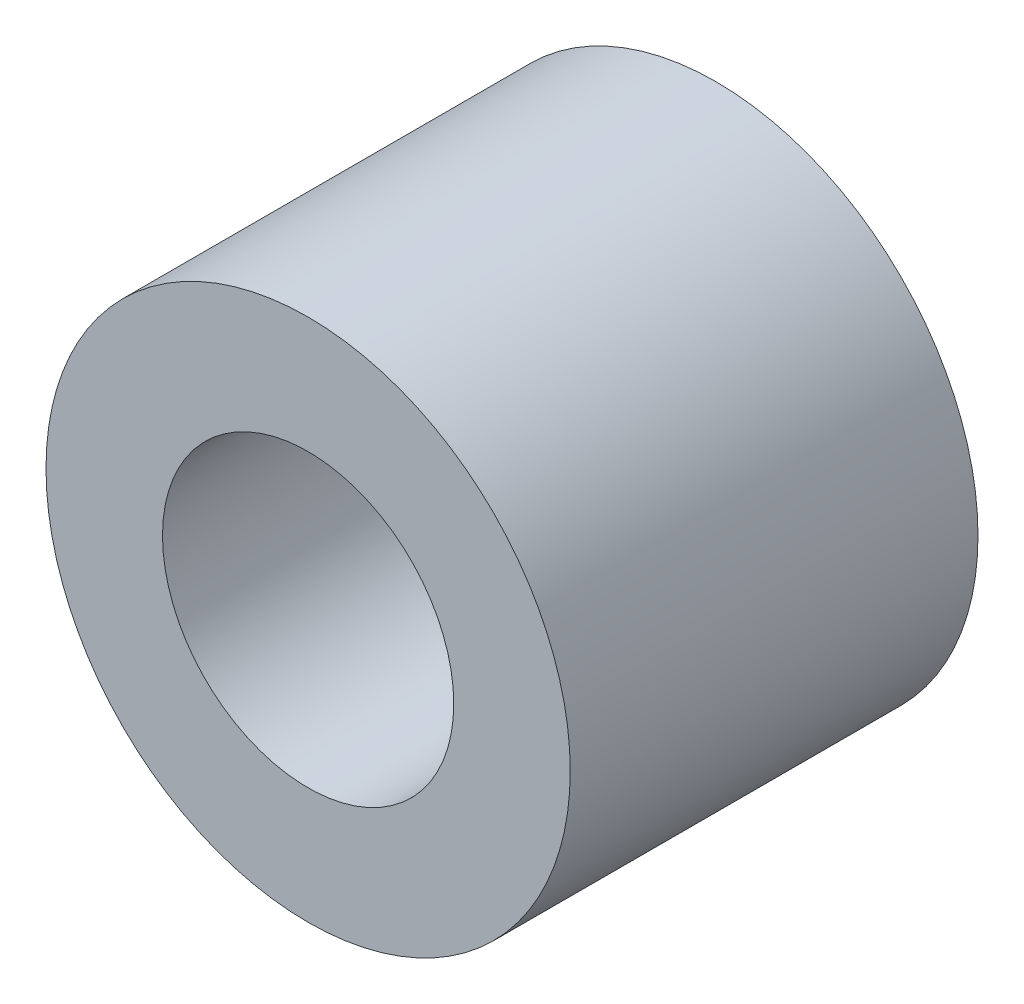
ISO-10303-21;
HEADER;
FILE_DESCRIPTION(('STEP AP214'),'2;1');
FILE_NAME('part.step','',(''),(''),'','','');
FILE_SCHEMA(('AUTOMOTIVE_DESIGN { 1 0 10303 214 1 1 1 1 }'));
ENDSEC;
DATA;
#1=APPLICATION_CONTEXT('core data for automotive mechanical design processes');
#2=APPLICATION_PROTOCOL_DEFINITION('international standard','automotive_design',2000,#1);
#3=PRODUCT_CONTEXT('',#1,'mechanical');
#4=PRODUCT('Part','Part','',(#3));
#5=PRODUCT_RELATED_PRODUCT_CATEGORY('part','',(#4));
#6=PRODUCT_DEFINITION_FORMATION('','',#4);
#7=PRODUCT_DEFINITION_CONTEXT('part definition',#1,'design');
#8=PRODUCT_DEFINITION('design','',#6,#7);
#9=PRODUCT_DEFINITION_SHAPE('','',#8);
#10=(LENGTH_UNIT() NAMED_UNIT(*) SI_UNIT(.MILLI.,.METRE.));
#11=(NAMED_UNIT(*) PLANE_ANGLE_UNIT() SI_UNIT($,.RADIAN.));
#12=(NAMED_UNIT(*) SI_UNIT($,.STERADIAN.) SOLID_ANGLE_UNIT());
#13=UNCERTAINTY_MEASURE_WITH_UNIT(LENGTH_MEASURE(1.E-05),#10,'distance_accuracy_value','');
#14=(GEOMETRIC_REPRESENTATION_CONTEXT(3) GLOBAL_UNCERTAINTY_ASSIGNED_CONTEXT((#13)) GLOBAL_UNIT_ASSIGNED_CONTEXT((#10,
#11,#12)) REPRESENTATION_CONTEXT('',''));
#15=CARTESIAN_POINT('',(0.,0.,0.));
#16=DIRECTION('',(0.,0.,1.));
#17=DIRECTION('',(1.,0.,0.));
#18=AXIS2_PLACEMENT_3D('',#15,#16,#17);
#19=CARTESIAN_POINT('',(0.,0.,7.));
#20=DIRECTION('',(0.,0.,1.));
#21=DIRECTION('',(1.,0.,0.));
#22=AXIS2_PLACEMENT_3D('',#19,#20,#21);
#23=PLANE('',#22);
#24=CARTESIAN_POINT('',(0.,0.,7.));
#25=DIRECTION('',(0.,0.,1.));
#26=DIRECTION('',(1.,0.,0.));
#27=AXIS2_PLACEMENT_3D('',#24,#25,#26);
#28=CIRCLE('',#27,4.5);
#29=CARTESIAN_POINT('',(4.5,0.,7.));
#30=VERTEX_POINT('',#29);
#31=EDGE_CURVE('E10',#30,#30,#28,.T.);
#32=ORIENTED_EDGE('',*,*,#31,.T.);
#33=EDGE_LOOP('',(#32));
#34=FACE_BOUND('',#33,.T.);
#35=CARTESIAN_POINT('',(0.,0.,7.));
#36=DIRECTION('',(0.,0.,1.));
#37=DIRECTION('',(1.,0.,0.));
#38=AXIS2_PLACEMENT_3D('',#35,#36,#37);
#39=CIRCLE('',#38,2.5);
#40=CARTESIAN_POINT('',(2.5,0.,7.));
#41=VERTEX_POINT('',#40);
#42=EDGE_CURVE('E41',#41,#41,#39,.T.);
#43=ORIENTED_EDGE('',*,*,#42,.F.);
#44=EDGE_LOOP('',(#43));
#45=FACE_BOUND('',#44,.T.);
#46=ADVANCED_FACE('F30',(#34,#45),#23,.T.);
#47=CARTESIAN_POINT('',(0.,0.,0.));
#48=DIRECTION('',(0.,0.,1.));
#49=DIRECTION('',(1.,0.,0.));
#50=AXIS2_PLACEMENT_3D('',#47,#48,#49);
#51=PLANE('',#50);
#52=CARTESIAN_POINT('',(0.,0.,0.));
#53=DIRECTION('',(0.,0.,1.));
#54=DIRECTION('',(1.,0.,0.));
#55=AXIS2_PLACEMENT_3D('',#52,#53,#54);
#56=CIRCLE('',#55,4.5);
#57=CARTESIAN_POINT('',(4.5,0.,0.));
#58=VERTEX_POINT('',#57);
#59=EDGE_CURVE('E34',#58,#58,#56,.T.);
#60=ORIENTED_EDGE('',*,*,#59,.F.);
#61=EDGE_LOOP('',(#60));
#62=FACE_BOUND('',#61,.T.);
#63=CARTESIAN_POINT('',(0.,0.,0.));
#64=DIRECTION('',(0.,0.,1.));
#65=DIRECTION('',(1.,0.,0.));
#66=AXIS2_PLACEMENT_3D('',#63,#64,#65);
#67=CIRCLE('',#66,2.5);
#68=CARTESIAN_POINT('',(2.5,0.,0.));
#69=VERTEX_POINT('',#68);
#70=EDGE_CURVE('E43',#69,#69,#67,.T.);
#71=ORIENTED_EDGE('',*,*,#70,.T.);
#72=EDGE_LOOP('',(#71));
#73=FACE_BOUND('',#72,.T.);
#74=ADVANCED_FACE('F53',(#62,#73),#51,.F.);
#75=CARTESIAN_POINT('',(0.,0.,7.));
#76=DIRECTION('',(0.,0.,-1.));
#77=DIRECTION('',(-1.,0.,0.));
#78=AXIS2_PLACEMENT_3D('',#75,#76,#77);
#79=CYLINDRICAL_SURFACE('',#78,4.5);
#80=ORIENTED_EDGE('',*,*,#31,.F.);
#81=EDGE_LOOP('',(#80));
#82=FACE_BOUND('',#81,.T.);
#83=ORIENTED_EDGE('',*,*,#59,.T.);
#84=EDGE_LOOP('',(#83));
#85=FACE_BOUND('',#84,.T.);
#86=ADVANCED_FACE('F32',(#82,#85),#79,.T.);
#87=CARTESIAN_POINT('',(0.,0.,7.));
#88=DIRECTION('',(0.,0.,-1.));
#89=DIRECTION('',(-1.,0.,0.));
#90=AXIS2_PLACEMENT_3D('',#87,#88,#89);
#91=CYLINDRICAL_SURFACE('',#90,2.5);
#92=ORIENTED_EDGE('',*,*,#42,.T.);
#93=EDGE_LOOP('',(#92));
#94=FACE_BOUND('',#93,.T.);
#95=ORIENTED_EDGE('',*,*,#70,.F.);
#96=EDGE_LOOP('',(#95));
#97=FACE_BOUND('',#96,.T.);
#98=ADVANCED_FACE('F49',(#94,#97),#91,.F.);
#99=CLOSED_SHELL('',(#46,#74,#86,#98));
#100=MANIFOLD_SOLID_BREP('B2',#99);
#101=ADVANCED_BREP_SHAPE_REPRESENTATION('',(#18,#100),#14);
#102=SHAPE_DEFINITION_REPRESENTATION(#9,#101);
ENDSEC;
END-ISO-10303-21;
